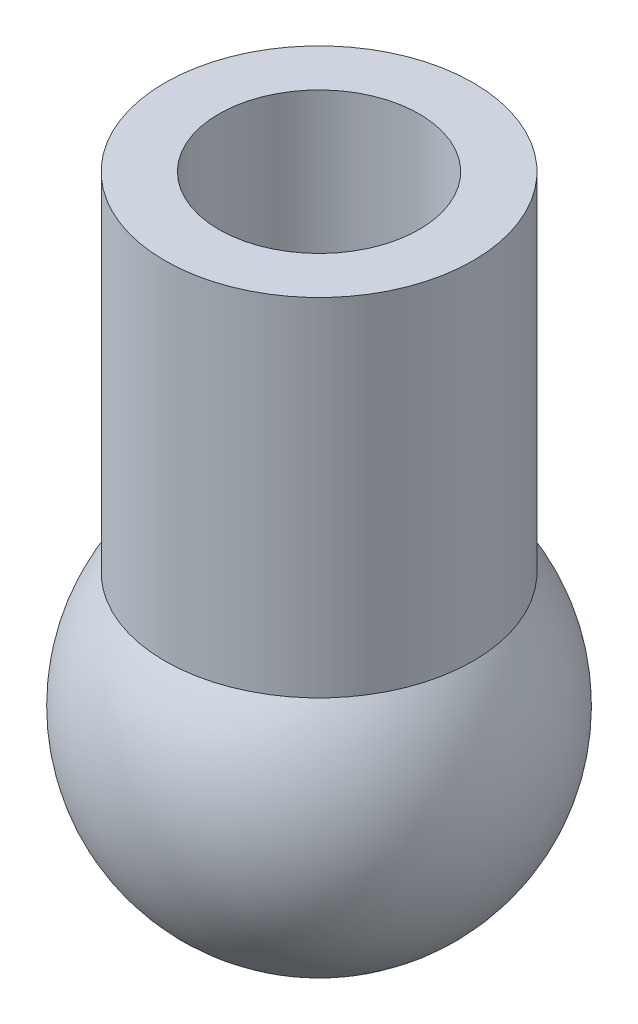
ISO-10303-21;
HEADER;
FILE_DESCRIPTION(('STEP AP214'),'2;1');
FILE_NAME('part.step','',(''),(''),'','','');
FILE_SCHEMA(('AUTOMOTIVE_DESIGN { 1 0 10303 214 1 1 1 1 }'));
ENDSEC;
DATA;
#1=APPLICATION_CONTEXT('core data for automotive mechanical design processes');
#2=APPLICATION_PROTOCOL_DEFINITION('international standard','automotive_design',2000,#1);
#3=PRODUCT_CONTEXT('',#1,'mechanical');
#4=PRODUCT('Part','Part','',(#3));
#5=PRODUCT_RELATED_PRODUCT_CATEGORY('part','',(#4));
#6=PRODUCT_DEFINITION_FORMATION('','',#4);
#7=PRODUCT_DEFINITION_CONTEXT('part definition',#1,'design');
#8=PRODUCT_DEFINITION('design','',#6,#7);
#9=PRODUCT_DEFINITION_SHAPE('','',#8);
#10=(LENGTH_UNIT() NAMED_UNIT(*) SI_UNIT(.MILLI.,.METRE.));
#11=(NAMED_UNIT(*) PLANE_ANGLE_UNIT() SI_UNIT($,.RADIAN.));
#12=(NAMED_UNIT(*) SI_UNIT($,.STERADIAN.) SOLID_ANGLE_UNIT());
#13=UNCERTAINTY_MEASURE_WITH_UNIT(LENGTH_MEASURE(1.E-05),#10,'distance_accuracy_value','');
#14=(GEOMETRIC_REPRESENTATION_CONTEXT(3) GLOBAL_UNCERTAINTY_ASSIGNED_CONTEXT((#13)) GLOBAL_UNIT_ASSIGNED_CONTEXT((#10,
#11,#12)) REPRESENTATION_CONTEXT('',''));
#15=CARTESIAN_POINT('',(0.,0.,0.));
#16=DIRECTION('',(0.,0.,1.));
#17=DIRECTION('',(1.,0.,0.));
#18=AXIS2_PLACEMENT_3D('',#15,#16,#17);
#19=CARTESIAN_POINT('',(0.,0.,0.));
#20=DIRECTION('',(1.,0.,0.));
#21=DIRECTION('',(0.,-1.,0.));
#22=AXIS2_PLACEMENT_3D('',#19,#20,#21);
#23=SPHERICAL_SURFACE('',#22,2.5);
#24=CARTESIAN_POINT('',(0.,0.,0.));
#25=DIRECTION('',(0.,1.,0.));
#26=DIRECTION('',(0.,0.,1.));
#27=AXIS2_PLACEMENT_3D('',#24,#25,#26);
#28=SPHERICAL_SURFACE('',#27,2.5);
#29=CARTESIAN_POINT('',(0.,-2.13541565040626,0.));
#30=DIRECTION('',(0.,1.,0.));
#31=DIRECTION('',(0.,0.,1.));
#32=AXIS2_PLACEMENT_3D('',#29,#30,#31);
#33=CIRCLE('',#32,1.3);
#34=CARTESIAN_POINT('',(0.,-2.13541565040626,1.3));
#35=VERTEX_POINT('',#34);
#36=EDGE_CURVE('E44',#35,#35,#33,.T.);
#37=ORIENTED_EDGE('',*,*,#36,.T.);
#38=EDGE_LOOP('',(#37));
#39=FACE_BOUND('',#38,.T.);
#40=CARTESIAN_POINT('',(0.,1.5,0.));
#41=DIRECTION('',(0.,-1.,0.));
#42=DIRECTION('',(0.,0.,-1.));
#43=AXIS2_PLACEMENT_3D('',#40,#41,#42);
#44=CIRCLE('',#43,2.);
#45=CARTESIAN_POINT('',(0.,1.5,-2.));
#46=VERTEX_POINT('',#45);
#47=EDGE_CURVE('E10',#46,#46,#44,.F.);
#48=ORIENTED_EDGE('',*,*,#47,.F.);
#49=EDGE_LOOP('',(#48));
#50=FACE_BOUND('',#49,.T.);
#51=ADVANCED_FACE('F37',(#39,#50),#28,.T.);
#52=CARTESIAN_POINT('',(0.,-15.,0.));
#53=DIRECTION('',(0.,1.,0.));
#54=DIRECTION('',(0.,0.,1.));
#55=AXIS2_PLACEMENT_3D('',#52,#53,#54);
#56=CYLINDRICAL_SURFACE('',#55,1.3);
#57=ORIENTED_EDGE('',*,*,#36,.F.);
#58=EDGE_LOOP('',(#57));
#59=FACE_BOUND('',#58,.T.);
#60=CARTESIAN_POINT('',(0.,6.,0.));
#61=DIRECTION('',(0.,1.,0.));
#62=DIRECTION('',(0.,0.,1.));
#63=AXIS2_PLACEMENT_3D('',#60,#61,#62);
#64=CIRCLE('',#63,1.3);
#65=CARTESIAN_POINT('',(0.,6.,1.3));
#66=VERTEX_POINT('',#65);
#67=EDGE_CURVE('E54',#66,#66,#64,.T.);
#68=ORIENTED_EDGE('',*,*,#67,.T.);
#69=EDGE_LOOP('',(#68));
#70=FACE_BOUND('',#69,.T.);
#71=ADVANCED_FACE('F61',(#59,#70),#56,.F.);
#72=CARTESIAN_POINT('',(0.,6.,0.));
#73=DIRECTION('',(0.,-1.,0.));
#74=DIRECTION('',(0.,0.,-1.));
#75=AXIS2_PLACEMENT_3D('',#72,#73,#74);
#76=CYLINDRICAL_SURFACE('',#75,2.);
#77=CARTESIAN_POINT('',(0.,6.,0.));
#78=DIRECTION('',(0.,1.,0.));
#79=DIRECTION('',(0.,0.,1.));
#80=AXIS2_PLACEMENT_3D('',#77,#78,#79);
#81=CIRCLE('',#80,2.);
#82=CARTESIAN_POINT('',(0.,6.,2.));
#83=VERTEX_POINT('',#82);
#84=EDGE_CURVE('E49',#83,#83,#81,.T.);
#85=ORIENTED_EDGE('',*,*,#84,.F.);
#86=EDGE_LOOP('',(#85));
#87=FACE_BOUND('',#86,.T.);
#88=ORIENTED_EDGE('',*,*,#47,.T.);
#89=EDGE_LOOP('',(#88));
#90=FACE_BOUND('',#89,.T.);
#91=ADVANCED_FACE('F65',(#87,#90),#76,.T.);
#92=CARTESIAN_POINT('',(0.,6.,0.));
#93=DIRECTION('',(0.,1.,0.));
#94=DIRECTION('',(0.,0.,1.));
#95=AXIS2_PLACEMENT_3D('',#92,#93,#94);
#96=PLANE('',#95);
#97=ORIENTED_EDGE('',*,*,#84,.T.);
#98=EDGE_LOOP('',(#97));
#99=FACE_BOUND('',#98,.T.);
#100=ORIENTED_EDGE('',*,*,#67,.F.);
#101=EDGE_LOOP('',(#100));
#102=FACE_BOUND('',#101,.T.);
#103=ADVANCED_FACE('F63',(#99,#102),#96,.T.);
#104=CLOSED_SHELL('',(#51,#71,#91,#103));
#105=MANIFOLD_SOLID_BREP('B2',#104);
#106=ADVANCED_BREP_SHAPE_REPRESENTATION('',(#18,#105),#14);
#107=SHAPE_DEFINITION_REPRESENTATION(#9,#106);
ENDSEC;
END-ISO-10303-21;
